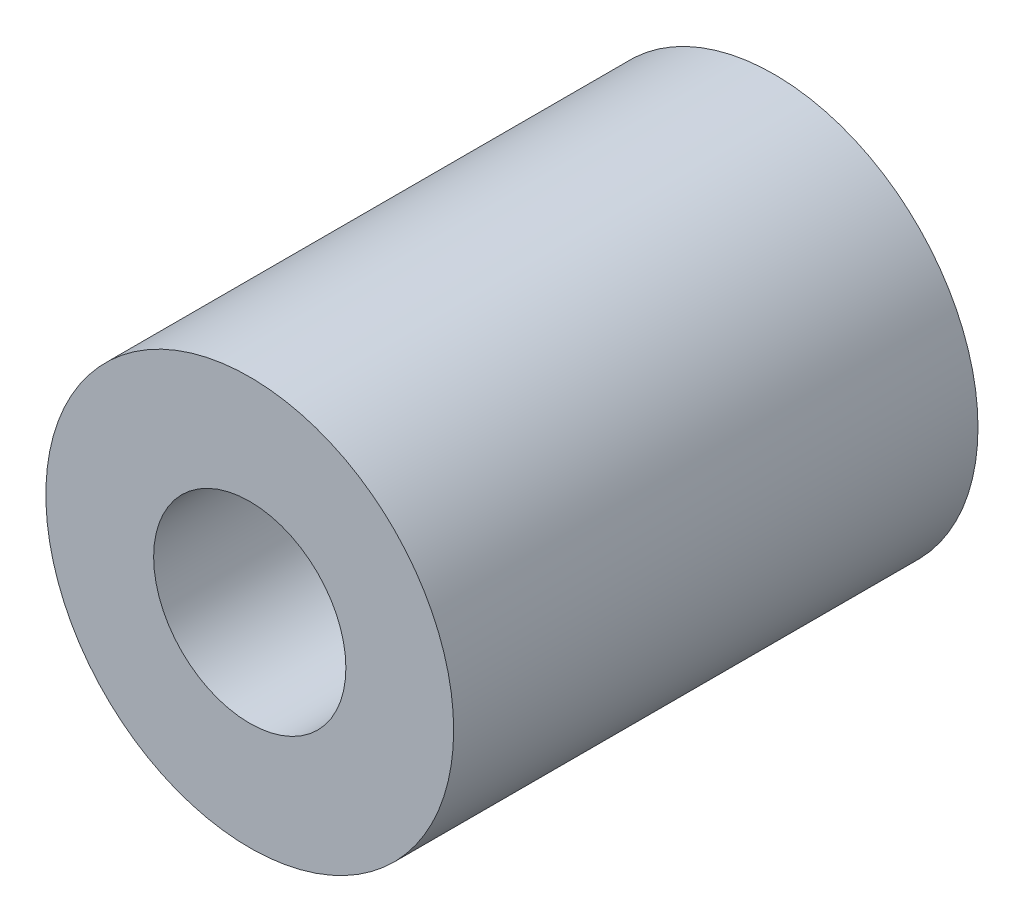
ISO-10303-21;
HEADER;
FILE_DESCRIPTION(('STEP AP214'),'2;1');
FILE_NAME('part.step','',(''),(''),'','','');
FILE_SCHEMA(('AUTOMOTIVE_DESIGN { 1 0 10303 214 1 1 1 1 }'));
ENDSEC;
DATA;
#1=APPLICATION_CONTEXT('core data for automotive mechanical design processes');
#2=APPLICATION_PROTOCOL_DEFINITION('international standard','automotive_design',2000,#1);
#3=PRODUCT_CONTEXT('',#1,'mechanical');
#4=PRODUCT('Part','Part','',(#3));
#5=PRODUCT_RELATED_PRODUCT_CATEGORY('part','',(#4));
#6=PRODUCT_DEFINITION_FORMATION('','',#4);
#7=PRODUCT_DEFINITION_CONTEXT('part definition',#1,'design');
#8=PRODUCT_DEFINITION('design','',#6,#7);
#9=PRODUCT_DEFINITION_SHAPE('','',#8);
#10=(LENGTH_UNIT() NAMED_UNIT(*) SI_UNIT(.MILLI.,.METRE.));
#11=(NAMED_UNIT(*) PLANE_ANGLE_UNIT() SI_UNIT($,.RADIAN.));
#12=(NAMED_UNIT(*) SI_UNIT($,.STERADIAN.) SOLID_ANGLE_UNIT());
#13=UNCERTAINTY_MEASURE_WITH_UNIT(LENGTH_MEASURE(1.E-05),#10,'distance_accuracy_value','');
#14=(GEOMETRIC_REPRESENTATION_CONTEXT(3) GLOBAL_UNCERTAINTY_ASSIGNED_CONTEXT((#13)) GLOBAL_UNIT_ASSIGNED_CONTEXT((#10,
#11,#12)) REPRESENTATION_CONTEXT('',''));
#15=CARTESIAN_POINT('',(0.,0.,0.));
#16=DIRECTION('',(0.,0.,1.));
#17=DIRECTION('',(1.,0.,0.));
#18=AXIS2_PLACEMENT_3D('',#15,#16,#17);
#19=CARTESIAN_POINT('',(0.,0.,9.));
#20=DIRECTION('',(0.,0.,-1.));
#21=DIRECTION('',(-1.,0.,0.));
#22=AXIS2_PLACEMENT_3D('',#19,#20,#21);
#23=CYLINDRICAL_SURFACE('',#22,3.5);
#24=CARTESIAN_POINT('',(0.,0.,9.));
#25=DIRECTION('',(0.,0.,1.));
#26=DIRECTION('',(1.,0.,0.));
#27=AXIS2_PLACEMENT_3D('',#24,#25,#26);
#28=CIRCLE('',#27,3.5);
#29=CARTESIAN_POINT('',(3.5,0.,9.));
#30=VERTEX_POINT('',#29);
#31=EDGE_CURVE('E10',#30,#30,#28,.T.);
#32=ORIENTED_EDGE('',*,*,#31,.F.);
#33=EDGE_LOOP('',(#32));
#34=FACE_BOUND('',#33,.T.);
#35=CARTESIAN_POINT('',(0.,0.,0.));
#36=DIRECTION('',(0.,0.,1.));
#37=DIRECTION('',(1.,0.,0.));
#38=AXIS2_PLACEMENT_3D('',#35,#36,#37);
#39=CIRCLE('',#38,3.5);
#40=CARTESIAN_POINT('',(3.5,0.,0.));
#41=VERTEX_POINT('',#40);
#42=EDGE_CURVE('E39',#41,#41,#39,.T.);
#43=ORIENTED_EDGE('',*,*,#42,.T.);
#44=EDGE_LOOP('',(#43));
#45=FACE_BOUND('',#44,.T.);
#46=ADVANCED_FACE('F36',(#34,#45),#23,.T.);
#47=CARTESIAN_POINT('',(0.,0.,9.));
#48=DIRECTION('',(0.,0.,1.));
#49=DIRECTION('',(1.,0.,0.));
#50=AXIS2_PLACEMENT_3D('',#47,#48,#49);
#51=PLANE('',#50);
#52=CARTESIAN_POINT('',(0.,0.,9.));
#53=DIRECTION('',(0.,0.,1.));
#54=DIRECTION('',(1.,0.,0.));
#55=AXIS2_PLACEMENT_3D('',#52,#53,#54);
#56=CIRCLE('',#55,1.65);
#57=CARTESIAN_POINT('',(1.65,0.,9.));
#58=VERTEX_POINT('',#57);
#59=EDGE_CURVE('E50',#58,#58,#56,.T.);
#60=ORIENTED_EDGE('',*,*,#59,.F.);
#61=EDGE_LOOP('',(#60));
#62=FACE_BOUND('',#61,.T.);
#63=ORIENTED_EDGE('',*,*,#31,.T.);
#64=EDGE_LOOP('',(#63));
#65=FACE_BOUND('',#64,.T.);
#66=ADVANCED_FACE('F56',(#62,#65),#51,.T.);
#67=CARTESIAN_POINT('',(0.,0.,0.));
#68=DIRECTION('',(0.,0.,1.));
#69=DIRECTION('',(1.,0.,0.));
#70=AXIS2_PLACEMENT_3D('',#67,#68,#69);
#71=PLANE('',#70);
#72=CARTESIAN_POINT('',(0.,0.,0.));
#73=DIRECTION('',(0.,0.,1.));
#74=DIRECTION('',(1.,0.,0.));
#75=AXIS2_PLACEMENT_3D('',#72,#73,#74);
#76=CIRCLE('',#75,1.65);
#77=CARTESIAN_POINT('',(1.65,0.,0.));
#78=VERTEX_POINT('',#77);
#79=EDGE_CURVE('E46',#78,#78,#76,.T.);
#80=ORIENTED_EDGE('',*,*,#79,.T.);
#81=EDGE_LOOP('',(#80));
#82=FACE_BOUND('',#81,.T.);
#83=ORIENTED_EDGE('',*,*,#42,.F.);
#84=EDGE_LOOP('',(#83));
#85=FACE_BOUND('',#84,.T.);
#86=ADVANCED_FACE('F58',(#82,#85),#71,.F.);
#87=CARTESIAN_POINT('',(0.,0.,9.));
#88=DIRECTION('',(0.,0.,1.));
#89=DIRECTION('',(1.,0.,0.));
#90=AXIS2_PLACEMENT_3D('',#87,#88,#89);
#91=CYLINDRICAL_SURFACE('',#90,1.65);
#92=ORIENTED_EDGE('',*,*,#79,.F.);
#93=EDGE_LOOP('',(#92));
#94=FACE_BOUND('',#93,.T.);
#95=ORIENTED_EDGE('',*,*,#59,.T.);
#96=EDGE_LOOP('',(#95));
#97=FACE_BOUND('',#96,.T.);
#98=ADVANCED_FACE('F54',(#94,#97),#91,.F.);
#99=CLOSED_SHELL('',(#46,#66,#86,#98));
#100=MANIFOLD_SOLID_BREP('B2',#99);
#101=ADVANCED_BREP_SHAPE_REPRESENTATION('',(#18,#100),#14);
#102=SHAPE_DEFINITION_REPRESENTATION(#9,#101);
ENDSEC;
END-ISO-10303-21;
